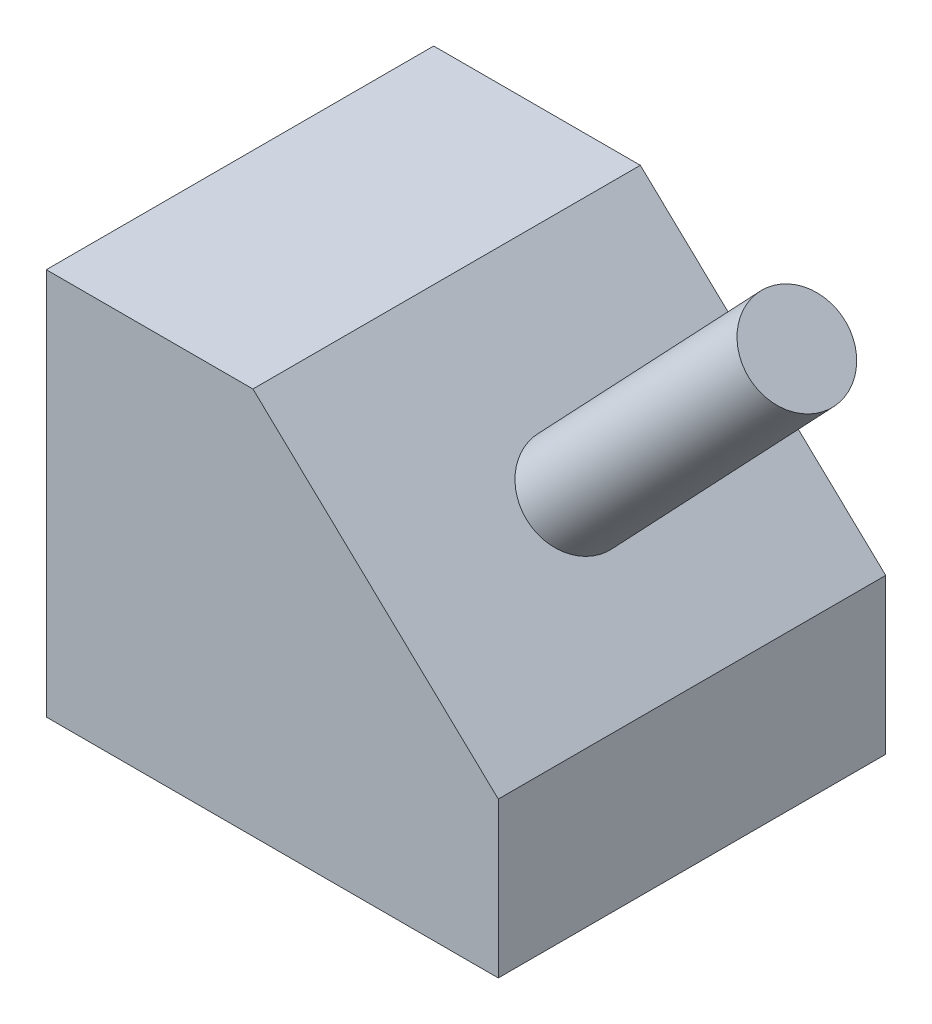
ISO-10303-21;
HEADER;
FILE_DESCRIPTION(('STEP AP214'),'2;1');
FILE_NAME('part.step','',(''),(''),'','','');
FILE_SCHEMA(('AUTOMOTIVE_DESIGN { 1 0 10303 214 1 1 1 1 }'));
ENDSEC;
DATA;
#1=APPLICATION_CONTEXT('core data for automotive mechanical design processes');
#2=APPLICATION_PROTOCOL_DEFINITION('international standard','automotive_design',2000,#1);
#3=PRODUCT_CONTEXT('',#1,'mechanical');
#4=PRODUCT('Part','Part','',(#3));
#5=PRODUCT_RELATED_PRODUCT_CATEGORY('part','',(#4));
#6=PRODUCT_DEFINITION_FORMATION('','',#4);
#7=PRODUCT_DEFINITION_CONTEXT('part definition',#1,'design');
#8=PRODUCT_DEFINITION('design','',#6,#7);
#9=PRODUCT_DEFINITION_SHAPE('','',#8);
#10=(LENGTH_UNIT() NAMED_UNIT(*) SI_UNIT(.MILLI.,.METRE.));
#11=(NAMED_UNIT(*) PLANE_ANGLE_UNIT() SI_UNIT($,.RADIAN.));
#12=(NAMED_UNIT(*) SI_UNIT($,.STERADIAN.) SOLID_ANGLE_UNIT());
#13=UNCERTAINTY_MEASURE_WITH_UNIT(LENGTH_MEASURE(1.E-05),#10,'distance_accuracy_value','');
#14=(GEOMETRIC_REPRESENTATION_CONTEXT(3) GLOBAL_UNCERTAINTY_ASSIGNED_CONTEXT((#13)) GLOBAL_UNIT_ASSIGNED_CONTEXT((#10,
#11,#12)) REPRESENTATION_CONTEXT('',''));
#15=CARTESIAN_POINT('',(0.,0.,0.));
#16=DIRECTION('',(0.,0.,1.));
#17=DIRECTION('',(1.,0.,0.));
#18=AXIS2_PLACEMENT_3D('',#15,#16,#17);
#19=CARTESIAN_POINT('',(0.,60.,60.));
#20=DIRECTION('',(1.,0.,0.));
#21=DIRECTION('',(0.,0.,-1.));
#22=AXIS2_PLACEMENT_3D('',#19,#20,#21);
#23=PLANE('',#22);
#24=DIRECTION('',(0.,-1.,0.));
#25=VECTOR('',#24,1.);
#26=CARTESIAN_POINT('',(0.,60.,0.));
#27=LINE('',#26,#25);
#28=CARTESIAN_POINT('',(0.,60.,0.));
#29=VERTEX_POINT('',#28);
#30=CARTESIAN_POINT('',(0.,0.,0.));
#31=VERTEX_POINT('',#30);
#32=EDGE_CURVE('E110',#29,#31,#27,.T.);
#33=ORIENTED_EDGE('',*,*,#32,.T.);
#34=DIRECTION('',(0.,0.,-1.));
#35=VECTOR('',#34,1.);
#36=CARTESIAN_POINT('',(0.,0.,60.));
#37=LINE('',#36,#35);
#38=CARTESIAN_POINT('',(0.,0.,60.));
#39=VERTEX_POINT('',#38);
#40=EDGE_CURVE('E36',#39,#31,#37,.T.);
#41=ORIENTED_EDGE('',*,*,#40,.F.);
#42=DIRECTION('',(0.,-1.,0.));
#43=VECTOR('',#42,1.);
#44=CARTESIAN_POINT('',(0.,60.,60.));
#45=LINE('',#44,#43);
#46=CARTESIAN_POINT('',(0.,60.,60.));
#47=VERTEX_POINT('',#46);
#48=EDGE_CURVE('E119',#47,#39,#45,.T.);
#49=ORIENTED_EDGE('',*,*,#48,.F.);
#50=DIRECTION('',(0.,0.,-1.));
#51=VECTOR('',#50,1.);
#52=CARTESIAN_POINT('',(0.,60.,60.));
#53=LINE('',#52,#51);
#54=EDGE_CURVE('E106',#47,#29,#53,.T.);
#55=ORIENTED_EDGE('',*,*,#54,.T.);
#56=EDGE_LOOP('',(#33,#41,#49,#55));
#57=FACE_BOUND('',#56,.T.);
#58=ADVANCED_FACE('F33',(#57),#23,.F.);
#59=CARTESIAN_POINT('',(0.,0.,60.));
#60=DIRECTION('',(0.,1.,0.));
#61=DIRECTION('',(0.,0.,1.));
#62=AXIS2_PLACEMENT_3D('',#59,#60,#61);
#63=PLANE('',#62);
#64=DIRECTION('',(1.,0.,0.));
#65=VECTOR('',#64,1.);
#66=CARTESIAN_POINT('',(0.,0.,0.));
#67=LINE('',#66,#65);
#68=CARTESIAN_POINT('',(70.,0.,0.));
#69=VERTEX_POINT('',#68);
#70=EDGE_CURVE('E113',#31,#69,#67,.T.);
#71=ORIENTED_EDGE('',*,*,#70,.T.);
#72=DIRECTION('',(0.,0.,-1.));
#73=VECTOR('',#72,1.);
#74=CARTESIAN_POINT('',(70.,0.,60.));
#75=LINE('',#74,#73);
#76=CARTESIAN_POINT('',(70.,0.,60.));
#77=VERTEX_POINT('',#76);
#78=EDGE_CURVE('E101',#77,#69,#75,.T.);
#79=ORIENTED_EDGE('',*,*,#78,.F.);
#80=DIRECTION('',(1.,0.,0.));
#81=VECTOR('',#80,1.);
#82=CARTESIAN_POINT('',(0.,0.,60.));
#83=LINE('',#82,#81);
#84=EDGE_CURVE('E85',#39,#77,#83,.T.);
#85=ORIENTED_EDGE('',*,*,#84,.F.);
#86=ORIENTED_EDGE('',*,*,#40,.T.);
#87=EDGE_LOOP('',(#71,#79,#85,#86));
#88=FACE_BOUND('',#87,.T.);
#89=ADVANCED_FACE('F122',(#88),#63,.F.);
#90=CARTESIAN_POINT('',(70.,0.,60.));
#91=DIRECTION('',(-1.,0.,0.));
#92=DIRECTION('',(0.,0.,1.));
#93=AXIS2_PLACEMENT_3D('',#90,#91,#92);
#94=PLANE('',#93);
#95=DIRECTION('',(0.,1.,0.));
#96=VECTOR('',#95,1.);
#97=CARTESIAN_POINT('',(70.,0.,0.));
#98=LINE('',#97,#96);
#99=CARTESIAN_POINT('',(70.,24.,0.));
#100=VERTEX_POINT('',#99);
#101=EDGE_CURVE('E100',#69,#100,#98,.T.);
#102=ORIENTED_EDGE('',*,*,#101,.T.);
#103=DIRECTION('',(0.,0.,-1.));
#104=VECTOR('',#103,1.);
#105=CARTESIAN_POINT('',(70.,24.,60.));
#106=LINE('',#105,#104);
#107=CARTESIAN_POINT('',(70.,24.,60.));
#108=VERTEX_POINT('',#107);
#109=EDGE_CURVE('E97',#108,#100,#106,.T.);
#110=ORIENTED_EDGE('',*,*,#109,.F.);
#111=DIRECTION('',(0.,1.,0.));
#112=VECTOR('',#111,1.);
#113=CARTESIAN_POINT('',(70.,0.,60.));
#114=LINE('',#113,#112);
#115=EDGE_CURVE('E89',#77,#108,#114,.T.);
#116=ORIENTED_EDGE('',*,*,#115,.F.);
#117=ORIENTED_EDGE('',*,*,#78,.T.);
#118=EDGE_LOOP('',(#102,#110,#116,#117));
#119=FACE_BOUND('',#118,.T.);
#120=ADVANCED_FACE('F98',(#119),#94,.F.);
#121=CARTESIAN_POINT('',(70.,24.,60.));
#122=DIRECTION('',(-0.687744647910783,-0.725952683905827,0.));
#123=DIRECTION('',(0.725952683905827,-0.687744647910783,0.));
#124=AXIS2_PLACEMENT_3D('',#121,#122,#123);
#125=PLANE('',#124);
#126=CARTESIAN_POINT('',(51.8511829023543,41.1936161977696,30.));
#127=DIRECTION('',(0.687744647910783,0.725952683905826,0.));
#128=DIRECTION('',(-0.725952683905826,0.687744647910783,0.));
#129=AXIS2_PLACEMENT_3D('',#126,#127,#128);
#130=CIRCLE('',#129,7.5);
#131=CARTESIAN_POINT('',(46.4065377730606,46.3517010571004,30.));
#132=VERTEX_POINT('',#131);
#133=EDGE_CURVE('E11',#132,#132,#130,.T.);
#134=ORIENTED_EDGE('',*,*,#133,.F.);
#135=EDGE_LOOP('',(#134));
#136=FACE_BOUND('',#135,.T.);
#137=DIRECTION('',(-0.725952683905827,0.687744647910783,0.));
#138=VECTOR('',#137,1.);
#139=CARTESIAN_POINT('',(70.,24.,0.));
#140=LINE('',#139,#138);
#141=CARTESIAN_POINT('',(32.,60.,0.));
#142=VERTEX_POINT('',#141);
#143=EDGE_CURVE('E70',#100,#142,#140,.T.);
#144=ORIENTED_EDGE('',*,*,#143,.T.);
#145=DIRECTION('',(0.,0.,-1.));
#146=VECTOR('',#145,1.);
#147=CARTESIAN_POINT('',(32.,60.,60.));
#148=LINE('',#147,#146);
#149=CARTESIAN_POINT('',(32.,60.,60.));
#150=VERTEX_POINT('',#149);
#151=EDGE_CURVE('E102',#150,#142,#148,.T.);
#152=ORIENTED_EDGE('',*,*,#151,.F.);
#153=DIRECTION('',(-0.725952683905827,0.687744647910783,0.));
#154=VECTOR('',#153,1.);
#155=CARTESIAN_POINT('',(70.,24.,60.));
#156=LINE('',#155,#154);
#157=EDGE_CURVE('E93',#108,#150,#156,.T.);
#158=ORIENTED_EDGE('',*,*,#157,.F.);
#159=ORIENTED_EDGE('',*,*,#109,.T.);
#160=EDGE_LOOP('',(#144,#152,#158,#159));
#161=FACE_BOUND('',#160,.T.);
#162=ADVANCED_FACE('F104',(#136,#161),#125,.F.);
#163=CARTESIAN_POINT('',(32.,60.,60.));
#164=DIRECTION('',(0.,-1.,0.));
#165=DIRECTION('',(1.,0.,0.));
#166=AXIS2_PLACEMENT_3D('',#163,#164,#165);
#167=PLANE('',#166);
#168=DIRECTION('',(-1.,0.,0.));
#169=VECTOR('',#168,1.);
#170=CARTESIAN_POINT('',(32.,60.,0.));
#171=LINE('',#170,#169);
#172=EDGE_CURVE('E76',#142,#29,#171,.T.);
#173=ORIENTED_EDGE('',*,*,#172,.T.);
#174=ORIENTED_EDGE('',*,*,#54,.F.);
#175=DIRECTION('',(-1.,0.,0.));
#176=VECTOR('',#175,1.);
#177=CARTESIAN_POINT('',(32.,60.,60.));
#178=LINE('',#177,#176);
#179=EDGE_CURVE('E50',#150,#47,#178,.T.);
#180=ORIENTED_EDGE('',*,*,#179,.F.);
#181=ORIENTED_EDGE('',*,*,#151,.T.);
#182=EDGE_LOOP('',(#173,#174,#180,#181));
#183=FACE_BOUND('',#182,.T.);
#184=ADVANCED_FACE('F138',(#183),#167,.F.);
#185=CARTESIAN_POINT('',(0.,0.,60.));
#186=DIRECTION('',(0.,0.,1.));
#187=DIRECTION('',(1.,0.,0.));
#188=AXIS2_PLACEMENT_3D('',#185,#186,#187);
#189=PLANE('',#188);
#190=ORIENTED_EDGE('',*,*,#48,.T.);
#191=ORIENTED_EDGE('',*,*,#84,.T.);
#192=ORIENTED_EDGE('',*,*,#115,.T.);
#193=ORIENTED_EDGE('',*,*,#157,.T.);
#194=ORIENTED_EDGE('',*,*,#179,.T.);
#195=EDGE_LOOP('',(#190,#191,#192,#193,#194));
#196=FACE_BOUND('',#195,.T.);
#197=ADVANCED_FACE('F91',(#196),#189,.T.);
#198=CARTESIAN_POINT('',(0.,0.,0.));
#199=DIRECTION('',(0.,0.,1.));
#200=DIRECTION('',(1.,0.,0.));
#201=AXIS2_PLACEMENT_3D('',#198,#199,#200);
#202=PLANE('',#201);
#203=ORIENTED_EDGE('',*,*,#32,.F.);
#204=ORIENTED_EDGE('',*,*,#172,.F.);
#205=ORIENTED_EDGE('',*,*,#143,.F.);
#206=ORIENTED_EDGE('',*,*,#101,.F.);
#207=ORIENTED_EDGE('',*,*,#70,.F.);
#208=EDGE_LOOP('',(#203,#204,#205,#206,#207));
#209=FACE_BOUND('',#208,.T.);
#210=ADVANCED_FACE('F127',(#209),#202,.F.);
#211=CARTESIAN_POINT('',(86.2384152978935,77.4912503930609,30.));
#212=DIRECTION('',(-0.687744647910783,-0.725952683905827,0.));
#213=DIRECTION('',(0.725952683905827,-0.687744647910783,0.));
#214=AXIS2_PLACEMENT_3D('',#211,#212,#213);
#215=CYLINDRICAL_SURFACE('',#214,7.5);
#216=CARTESIAN_POINT('',(86.2384152978935,77.4912503930609,30.));
#217=DIRECTION('',(0.687744647910783,0.725952683905826,0.));
#218=DIRECTION('',(-0.725952683905826,0.687744647910783,0.));
#219=AXIS2_PLACEMENT_3D('',#216,#217,#218);
#220=CIRCLE('',#219,7.5);
#221=CARTESIAN_POINT('',(80.7937701685998,82.6493352523918,30.));
#222=VERTEX_POINT('',#221);
#223=EDGE_CURVE('E114',#222,#222,#220,.T.);
#224=ORIENTED_EDGE('',*,*,#223,.F.);
#225=EDGE_LOOP('',(#224));
#226=FACE_BOUND('',#225,.T.);
#227=ORIENTED_EDGE('',*,*,#133,.T.);
#228=EDGE_LOOP('',(#227));
#229=FACE_BOUND('',#228,.T.);
#230=ADVANCED_FACE('F129',(#226,#229),#215,.T.);
#231=CARTESIAN_POINT('',(86.2384152978935,77.4912503930609,30.));
#232=DIRECTION('',(0.687744647910783,0.725952683905826,0.));
#233=DIRECTION('',(-0.725952683905826,0.687744647910783,0.));
#234=AXIS2_PLACEMENT_3D('',#231,#232,#233);
#235=PLANE('',#234);
#236=ORIENTED_EDGE('',*,*,#223,.T.);
#237=EDGE_LOOP('',(#236));
#238=FACE_BOUND('',#237,.T.);
#239=ADVANCED_FACE('F135',(#238),#235,.T.);
#240=CLOSED_SHELL('',(#58,#89,#120,#162,#184,#197,#210,#230,#239));
#241=MANIFOLD_SOLID_BREP('B2',#240);
#242=ADVANCED_BREP_SHAPE_REPRESENTATION('',(#18,#241),#14);
#243=SHAPE_DEFINITION_REPRESENTATION(#9,#242);
ENDSEC;
END-ISO-10303-21;
